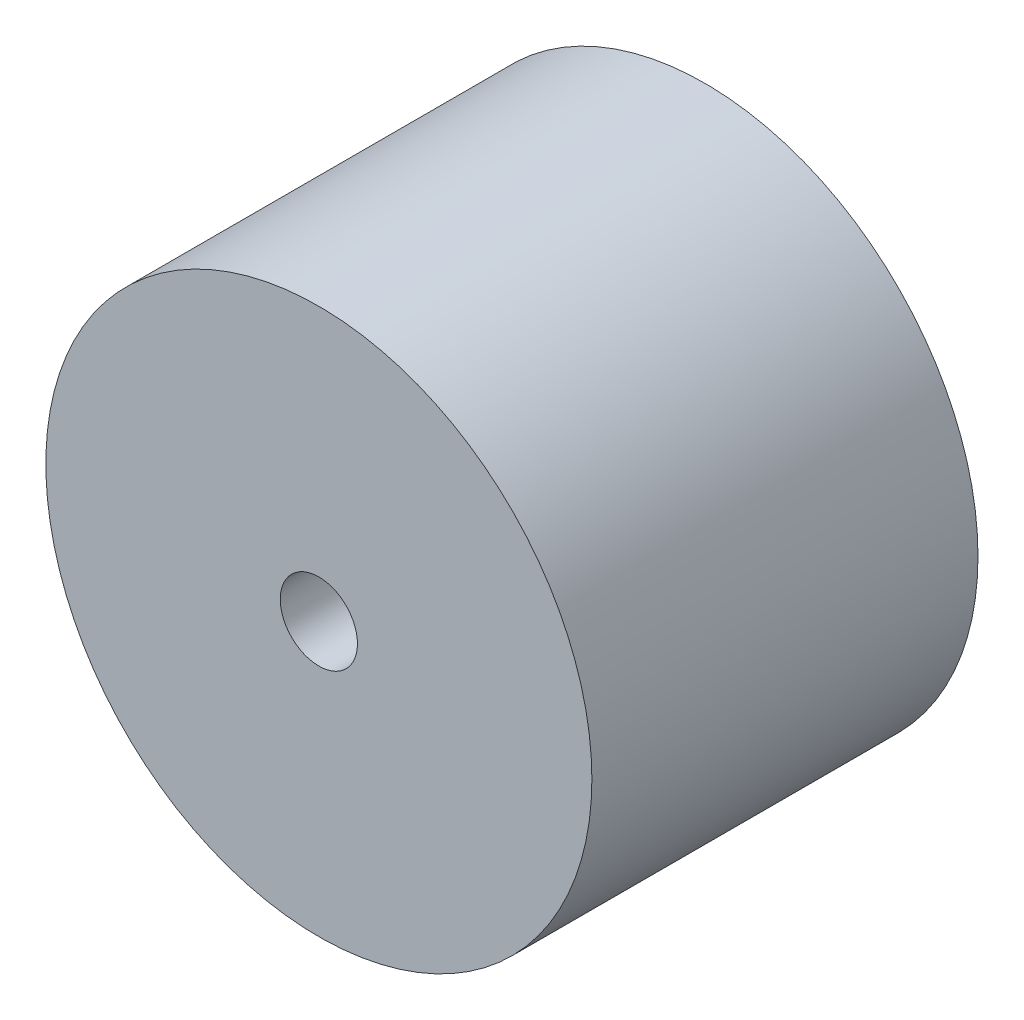
ISO-10303-21;
HEADER;
FILE_DESCRIPTION(('STEP AP214'),'2;1');
FILE_NAME('part.step','',(''),(''),'','','');
FILE_SCHEMA(('AUTOMOTIVE_DESIGN { 1 0 10303 214 1 1 1 1 }'));
ENDSEC;
DATA;
#1=APPLICATION_CONTEXT('core data for automotive mechanical design processes');
#2=APPLICATION_PROTOCOL_DEFINITION('international standard','automotive_design',2000,#1);
#3=PRODUCT_CONTEXT('',#1,'mechanical');
#4=PRODUCT('Part','Part','',(#3));
#5=PRODUCT_RELATED_PRODUCT_CATEGORY('part','',(#4));
#6=PRODUCT_DEFINITION_FORMATION('','',#4);
#7=PRODUCT_DEFINITION_CONTEXT('part definition',#1,'design');
#8=PRODUCT_DEFINITION('design','',#6,#7);
#9=PRODUCT_DEFINITION_SHAPE('','',#8);
#10=(LENGTH_UNIT() NAMED_UNIT(*) SI_UNIT(.MILLI.,.METRE.));
#11=(NAMED_UNIT(*) PLANE_ANGLE_UNIT() SI_UNIT($,.RADIAN.));
#12=(NAMED_UNIT(*) SI_UNIT($,.STERADIAN.) SOLID_ANGLE_UNIT());
#13=UNCERTAINTY_MEASURE_WITH_UNIT(LENGTH_MEASURE(1.E-05),#10,'distance_accuracy_value','');
#14=(GEOMETRIC_REPRESENTATION_CONTEXT(3) GLOBAL_UNCERTAINTY_ASSIGNED_CONTEXT((#13)) GLOBAL_UNIT_ASSIGNED_CONTEXT((#10,
#11,#12)) REPRESENTATION_CONTEXT('',''));
#15=CARTESIAN_POINT('',(0.,0.,0.));
#16=DIRECTION('',(0.,0.,1.));
#17=DIRECTION('',(1.,0.,0.));
#18=AXIS2_PLACEMENT_3D('',#15,#16,#17);
#19=CARTESIAN_POINT('',(0.,0.,15.));
#20=DIRECTION('',(0.,0.,1.));
#21=DIRECTION('',(1.,0.,0.));
#22=AXIS2_PLACEMENT_3D('',#19,#20,#21);
#23=PLANE('',#22);
#24=CARTESIAN_POINT('',(0.,0.,15.));
#25=DIRECTION('',(0.,0.,1.));
#26=DIRECTION('',(1.,0.,0.));
#27=AXIS2_PLACEMENT_3D('',#24,#25,#26);
#28=CIRCLE('',#27,10.6066017177982);
#29=CARTESIAN_POINT('',(10.6066017177982,0.,15.));
#30=VERTEX_POINT('',#29);
#31=EDGE_CURVE('E10',#30,#30,#28,.T.);
#32=ORIENTED_EDGE('',*,*,#31,.T.);
#33=EDGE_LOOP('',(#32));
#34=FACE_BOUND('',#33,.T.);
#35=CARTESIAN_POINT('',(0.,0.,15.));
#36=DIRECTION('',(0.,0.,1.));
#37=DIRECTION('',(1.,0.,0.));
#38=AXIS2_PLACEMENT_3D('',#35,#36,#37);
#39=CIRCLE('',#38,1.5);
#40=CARTESIAN_POINT('',(1.5,0.,15.));
#41=VERTEX_POINT('',#40);
#42=EDGE_CURVE('E56',#41,#41,#39,.T.);
#43=ORIENTED_EDGE('',*,*,#42,.F.);
#44=EDGE_LOOP('',(#43));
#45=FACE_BOUND('',#44,.T.);
#46=ADVANCED_FACE('F43',(#34,#45),#23,.T.);
#47=CARTESIAN_POINT('',(0.,0.,0.));
#48=DIRECTION('',(0.,0.,1.));
#49=DIRECTION('',(1.,0.,0.));
#50=AXIS2_PLACEMENT_3D('',#47,#48,#49);
#51=PLANE('',#50);
#52=CARTESIAN_POINT('',(0.,0.,0.));
#53=DIRECTION('',(0.,0.,1.));
#54=DIRECTION('',(1.,0.,0.));
#55=AXIS2_PLACEMENT_3D('',#52,#53,#54);
#56=CIRCLE('',#55,10.6066017177982);
#57=CARTESIAN_POINT('',(10.6066017177982,0.,0.));
#58=VERTEX_POINT('',#57);
#59=EDGE_CURVE('E47',#58,#58,#56,.T.);
#60=ORIENTED_EDGE('',*,*,#59,.F.);
#61=EDGE_LOOP('',(#60));
#62=FACE_BOUND('',#61,.T.);
#63=CARTESIAN_POINT('',(0.,0.,0.));
#64=DIRECTION('',(0.,0.,1.));
#65=DIRECTION('',(1.,0.,0.));
#66=AXIS2_PLACEMENT_3D('',#63,#64,#65);
#67=CIRCLE('',#66,1.5);
#68=CARTESIAN_POINT('',(1.5,0.,0.));
#69=VERTEX_POINT('',#68);
#70=EDGE_CURVE('E58',#69,#69,#67,.T.);
#71=ORIENTED_EDGE('',*,*,#70,.T.);
#72=EDGE_LOOP('',(#71));
#73=FACE_BOUND('',#72,.T.);
#74=ADVANCED_FACE('F70',(#62,#73),#51,.F.);
#75=CARTESIAN_POINT('',(0.,0.,15.));
#76=DIRECTION('',(0.,0.,-1.));
#77=DIRECTION('',(-1.,0.,0.));
#78=AXIS2_PLACEMENT_3D('',#75,#76,#77);
#79=CYLINDRICAL_SURFACE('',#78,10.6066017177982);
#80=ORIENTED_EDGE('',*,*,#31,.F.);
#81=EDGE_LOOP('',(#80));
#82=FACE_BOUND('',#81,.T.);
#83=ORIENTED_EDGE('',*,*,#59,.T.);
#84=EDGE_LOOP('',(#83));
#85=FACE_BOUND('',#84,.T.);
#86=ADVANCED_FACE('F45',(#82,#85),#79,.T.);
#87=CARTESIAN_POINT('',(0.,0.,15.));
#88=DIRECTION('',(0.,0.,-1.));
#89=DIRECTION('',(-1.,0.,0.));
#90=AXIS2_PLACEMENT_3D('',#87,#88,#89);
#91=CYLINDRICAL_SURFACE('',#90,1.5);
#92=ORIENTED_EDGE('',*,*,#42,.T.);
#93=EDGE_LOOP('',(#92));
#94=FACE_BOUND('',#93,.T.);
#95=ORIENTED_EDGE('',*,*,#70,.F.);
#96=EDGE_LOOP('',(#95));
#97=FACE_BOUND('',#96,.T.);
#98=ADVANCED_FACE('F66',(#94,#97),#91,.F.);
#99=CLOSED_SHELL('',(#46,#74,#86,#98));
#100=MANIFOLD_SOLID_BREP('B2',#99);
#101=ADVANCED_BREP_SHAPE_REPRESENTATION('',(#18,#100),#14);
#102=SHAPE_DEFINITION_REPRESENTATION(#9,#101);
ENDSEC;
END-ISO-10303-21;
